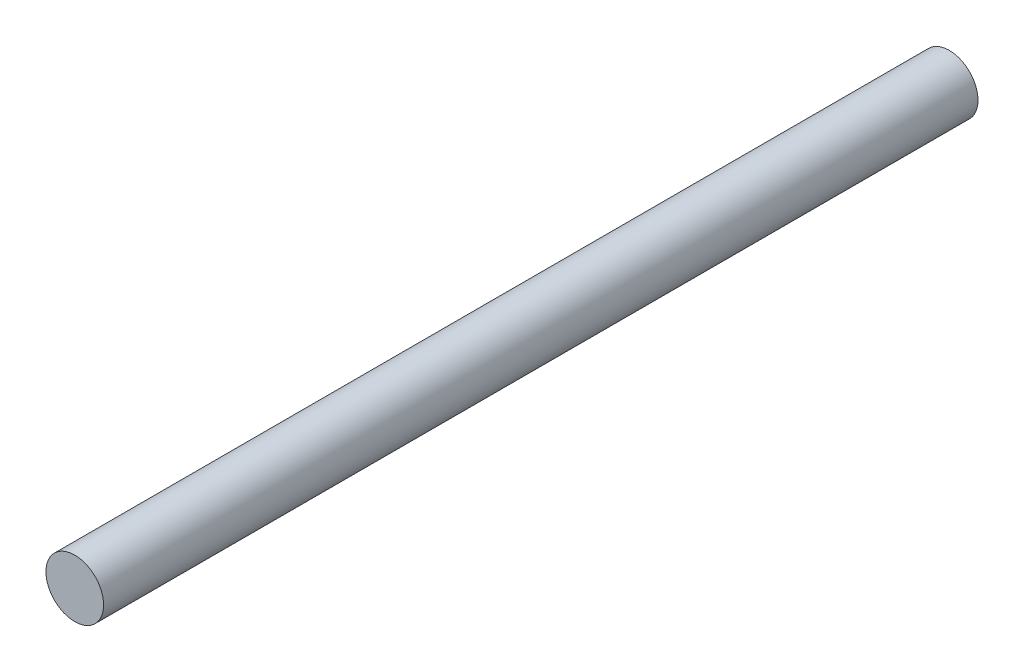
ISO-10303-21;
HEADER;
FILE_DESCRIPTION(('STEP AP214'),'2;1');
FILE_NAME('part.step','',(''),(''),'','','');
FILE_SCHEMA(('AUTOMOTIVE_DESIGN { 1 0 10303 214 1 1 1 1 }'));
ENDSEC;
DATA;
#1=APPLICATION_CONTEXT('core data for automotive mechanical design processes');
#2=APPLICATION_PROTOCOL_DEFINITION('international standard','automotive_design',2000,#1);
#3=PRODUCT_CONTEXT('',#1,'mechanical');
#4=PRODUCT('Part','Part','',(#3));
#5=PRODUCT_RELATED_PRODUCT_CATEGORY('part','',(#4));
#6=PRODUCT_DEFINITION_FORMATION('','',#4);
#7=PRODUCT_DEFINITION_CONTEXT('part definition',#1,'design');
#8=PRODUCT_DEFINITION('design','',#6,#7);
#9=PRODUCT_DEFINITION_SHAPE('','',#8);
#10=(LENGTH_UNIT() NAMED_UNIT(*) SI_UNIT(.MILLI.,.METRE.));
#11=(NAMED_UNIT(*) PLANE_ANGLE_UNIT() SI_UNIT($,.RADIAN.));
#12=(NAMED_UNIT(*) SI_UNIT($,.STERADIAN.) SOLID_ANGLE_UNIT());
#13=UNCERTAINTY_MEASURE_WITH_UNIT(LENGTH_MEASURE(1.E-05),#10,'distance_accuracy_value','');
#14=(GEOMETRIC_REPRESENTATION_CONTEXT(3) GLOBAL_UNCERTAINTY_ASSIGNED_CONTEXT((#13)) GLOBAL_UNIT_ASSIGNED_CONTEXT((#10,
#11,#12)) REPRESENTATION_CONTEXT('',''));
#15=CARTESIAN_POINT('',(0.,0.,0.));
#16=DIRECTION('',(0.,0.,1.));
#17=DIRECTION('',(1.,0.,0.));
#18=AXIS2_PLACEMENT_3D('',#15,#16,#17);
#19=CARTESIAN_POINT('',(0.,0.,91.));
#20=DIRECTION('',(0.,0.,-1.));
#21=DIRECTION('',(-1.,0.,0.));
#22=AXIS2_PLACEMENT_3D('',#19,#20,#21);
#23=CYLINDRICAL_SURFACE('',#22,3.);
#24=CARTESIAN_POINT('',(0.,0.,91.));
#25=DIRECTION('',(0.,0.,1.));
#26=DIRECTION('',(1.,0.,0.));
#27=AXIS2_PLACEMENT_3D('',#24,#25,#26);
#28=CIRCLE('',#27,3.);
#29=CARTESIAN_POINT('',(3.,0.,91.));
#30=VERTEX_POINT('',#29);
#31=EDGE_CURVE('E10',#30,#30,#28,.T.);
#32=ORIENTED_EDGE('',*,*,#31,.F.);
#33=EDGE_LOOP('',(#32));
#34=FACE_BOUND('',#33,.T.);
#35=CARTESIAN_POINT('',(0.,0.,0.));
#36=DIRECTION('',(0.,0.,1.));
#37=DIRECTION('',(1.,0.,0.));
#38=AXIS2_PLACEMENT_3D('',#35,#36,#37);
#39=CIRCLE('',#38,3.);
#40=CARTESIAN_POINT('',(3.,0.,0.));
#41=VERTEX_POINT('',#40);
#42=EDGE_CURVE('E40',#41,#41,#39,.T.);
#43=ORIENTED_EDGE('',*,*,#42,.T.);
#44=EDGE_LOOP('',(#43));
#45=FACE_BOUND('',#44,.T.);
#46=ADVANCED_FACE('F37',(#34,#45),#23,.T.);
#47=CARTESIAN_POINT('',(0.,0.,91.));
#48=DIRECTION('',(0.,0.,1.));
#49=DIRECTION('',(1.,0.,0.));
#50=AXIS2_PLACEMENT_3D('',#47,#48,#49);
#51=PLANE('',#50);
#52=ORIENTED_EDGE('',*,*,#31,.T.);
#53=EDGE_LOOP('',(#52));
#54=FACE_BOUND('',#53,.T.);
#55=ADVANCED_FACE('F54',(#54),#51,.T.);
#56=CARTESIAN_POINT('',(0.,0.,0.));
#57=DIRECTION('',(0.,0.,1.));
#58=DIRECTION('',(1.,0.,0.));
#59=AXIS2_PLACEMENT_3D('',#56,#57,#58);
#60=PLANE('',#59);
#61=ORIENTED_EDGE('',*,*,#42,.F.);
#62=EDGE_LOOP('',(#61));
#63=FACE_BOUND('',#62,.T.);
#64=ADVANCED_FACE('F52',(#63),#60,.F.);
#65=CLOSED_SHELL('',(#46,#55,#64));
#66=MANIFOLD_SOLID_BREP('B2',#65);
#67=ADVANCED_BREP_SHAPE_REPRESENTATION('',(#18,#66),#14);
#68=SHAPE_DEFINITION_REPRESENTATION(#9,#67);
ENDSEC;
END-ISO-10303-21;
